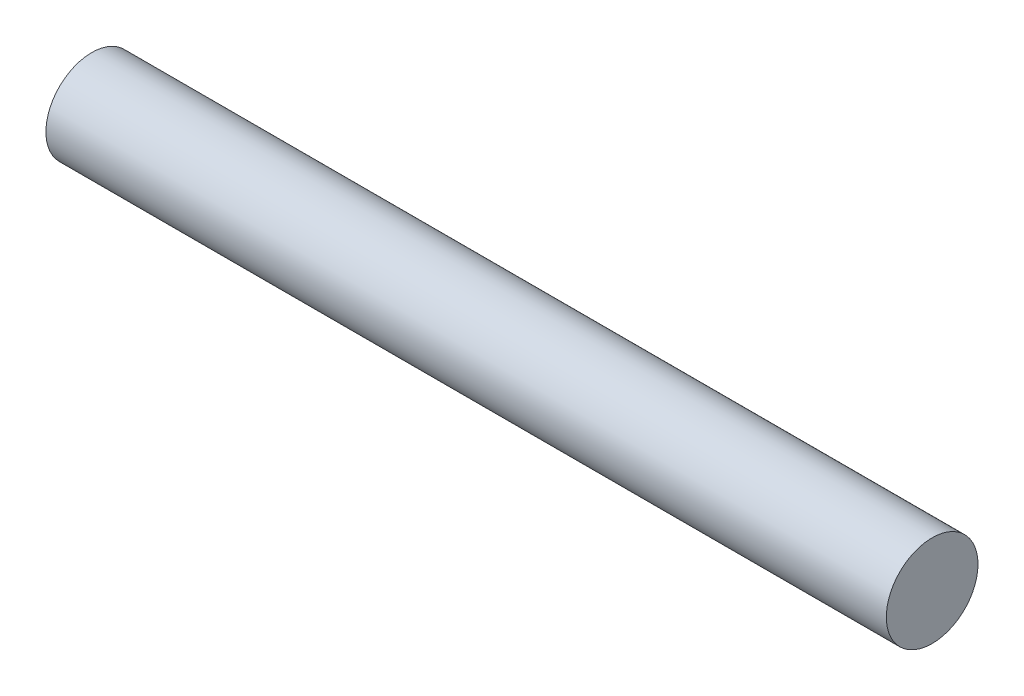
ISO-10303-21;
HEADER;
FILE_DESCRIPTION(('STEP AP214'),'2;1');
FILE_NAME('part.step','',(''),(''),'','','');
FILE_SCHEMA(('AUTOMOTIVE_DESIGN { 1 0 10303 214 1 1 1 1 }'));
ENDSEC;
DATA;
#1=APPLICATION_CONTEXT('core data for automotive mechanical design processes');
#2=APPLICATION_PROTOCOL_DEFINITION('international standard','automotive_design',2000,#1);
#3=PRODUCT_CONTEXT('',#1,'mechanical');
#4=PRODUCT('Part','Part','',(#3));
#5=PRODUCT_RELATED_PRODUCT_CATEGORY('part','',(#4));
#6=PRODUCT_DEFINITION_FORMATION('','',#4);
#7=PRODUCT_DEFINITION_CONTEXT('part definition',#1,'design');
#8=PRODUCT_DEFINITION('design','',#6,#7);
#9=PRODUCT_DEFINITION_SHAPE('','',#8);
#10=(LENGTH_UNIT() NAMED_UNIT(*) SI_UNIT(.MILLI.,.METRE.));
#11=(NAMED_UNIT(*) PLANE_ANGLE_UNIT() SI_UNIT($,.RADIAN.));
#12=(NAMED_UNIT(*) SI_UNIT($,.STERADIAN.) SOLID_ANGLE_UNIT());
#13=UNCERTAINTY_MEASURE_WITH_UNIT(LENGTH_MEASURE(1.E-05),#10,'distance_accuracy_value','');
#14=(GEOMETRIC_REPRESENTATION_CONTEXT(3) GLOBAL_UNCERTAINTY_ASSIGNED_CONTEXT((#13)) GLOBAL_UNIT_ASSIGNED_CONTEXT((#10,
#11,#12)) REPRESENTATION_CONTEXT('',''));
#15=CARTESIAN_POINT('',(0.,0.,0.));
#16=DIRECTION('',(0.,0.,1.));
#17=DIRECTION('',(1.,0.,0.));
#18=AXIS2_PLACEMENT_3D('',#15,#16,#17);
#19=CARTESIAN_POINT('',(55.,0.,0.));
#20=DIRECTION('',(-1.,0.,0.));
#21=DIRECTION('',(0.,0.,1.));
#22=AXIS2_PLACEMENT_3D('',#19,#20,#21);
#23=CYLINDRICAL_SURFACE('',#22,3.);
#24=CARTESIAN_POINT('',(55.,0.,0.));
#25=DIRECTION('',(1.,0.,0.));
#26=DIRECTION('',(0.,0.,-1.));
#27=AXIS2_PLACEMENT_3D('',#24,#25,#26);
#28=CIRCLE('',#27,3.);
#29=CARTESIAN_POINT('',(55.,0.,-3.));
#30=VERTEX_POINT('',#29);
#31=EDGE_CURVE('E10',#30,#30,#28,.T.);
#32=ORIENTED_EDGE('',*,*,#31,.F.);
#33=EDGE_LOOP('',(#32));
#34=FACE_BOUND('',#33,.T.);
#35=CARTESIAN_POINT('',(0.,0.,0.));
#36=DIRECTION('',(1.,0.,0.));
#37=DIRECTION('',(0.,0.,-1.));
#38=AXIS2_PLACEMENT_3D('',#35,#36,#37);
#39=CIRCLE('',#38,3.);
#40=CARTESIAN_POINT('',(0.,0.,-3.));
#41=VERTEX_POINT('',#40);
#42=EDGE_CURVE('E33',#41,#41,#39,.T.);
#43=ORIENTED_EDGE('',*,*,#42,.T.);
#44=EDGE_LOOP('',(#43));
#45=FACE_BOUND('',#44,.T.);
#46=ADVANCED_FACE('F30',(#34,#45),#23,.T.);
#47=CARTESIAN_POINT('',(55.,0.,0.));
#48=DIRECTION('',(1.,0.,0.));
#49=DIRECTION('',(0.,0.,-1.));
#50=AXIS2_PLACEMENT_3D('',#47,#48,#49);
#51=PLANE('',#50);
#52=ORIENTED_EDGE('',*,*,#31,.T.);
#53=EDGE_LOOP('',(#52));
#54=FACE_BOUND('',#53,.T.);
#55=ADVANCED_FACE('F45',(#54),#51,.T.);
#56=CARTESIAN_POINT('',(0.,0.,0.));
#57=DIRECTION('',(1.,0.,0.));
#58=DIRECTION('',(0.,0.,-1.));
#59=AXIS2_PLACEMENT_3D('',#56,#57,#58);
#60=PLANE('',#59);
#61=ORIENTED_EDGE('',*,*,#42,.F.);
#62=EDGE_LOOP('',(#61));
#63=FACE_BOUND('',#62,.T.);
#64=ADVANCED_FACE('F43',(#63),#60,.F.);
#65=CLOSED_SHELL('',(#46,#55,#64));
#66=MANIFOLD_SOLID_BREP('B2',#65);
#67=ADVANCED_BREP_SHAPE_REPRESENTATION('',(#18,#66),#14);
#68=SHAPE_DEFINITION_REPRESENTATION(#9,#67);
ENDSEC;
END-ISO-10303-21;
